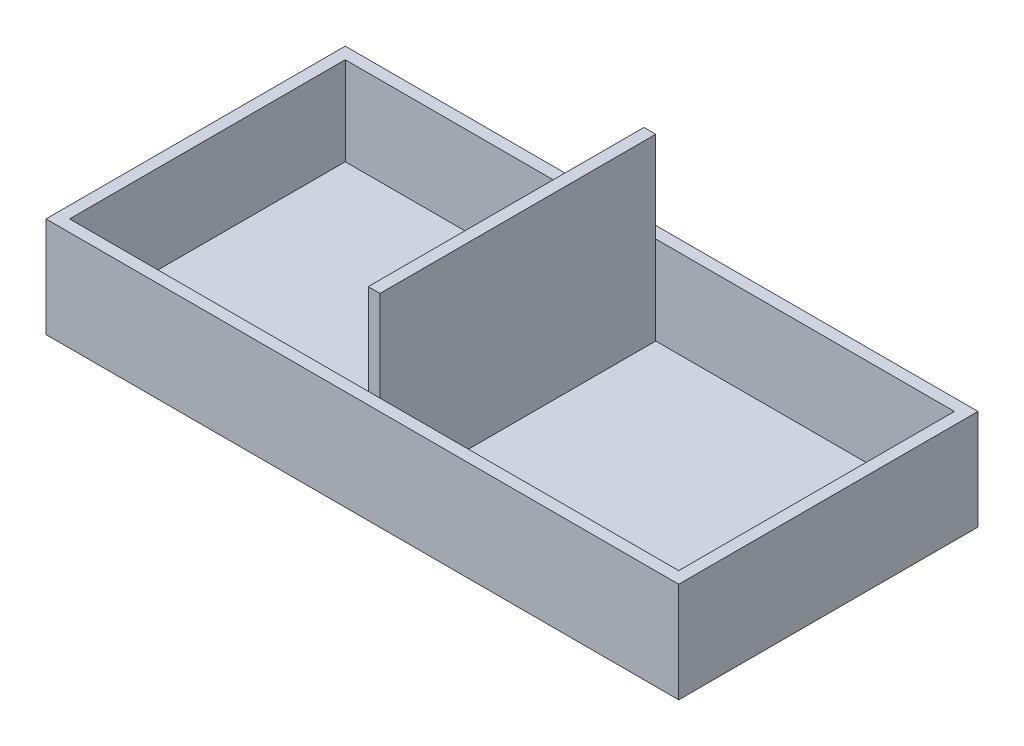
ISO-10303-21;
HEADER;
FILE_DESCRIPTION(('STEP AP214'),'2;1');
FILE_NAME('part.step','',(''),(''),'','','');
FILE_SCHEMA(('AUTOMOTIVE_DESIGN { 1 0 10303 214 1 1 1 1 }'));
ENDSEC;
DATA;
#1=APPLICATION_CONTEXT('core data for automotive mechanical design processes');
#2=APPLICATION_PROTOCOL_DEFINITION('international standard','automotive_design',2000,#1);
#3=PRODUCT_CONTEXT('',#1,'mechanical');
#4=PRODUCT('Part','Part','',(#3));
#5=PRODUCT_RELATED_PRODUCT_CATEGORY('part','',(#4));
#6=PRODUCT_DEFINITION_FORMATION('','',#4);
#7=PRODUCT_DEFINITION_CONTEXT('part definition',#1,'design');
#8=PRODUCT_DEFINITION('design','',#6,#7);
#9=PRODUCT_DEFINITION_SHAPE('','',#8);
#10=(LENGTH_UNIT() NAMED_UNIT(*) SI_UNIT(.MILLI.,.METRE.));
#11=(NAMED_UNIT(*) PLANE_ANGLE_UNIT() SI_UNIT($,.RADIAN.));
#12=(NAMED_UNIT(*) SI_UNIT($,.STERADIAN.) SOLID_ANGLE_UNIT());
#13=UNCERTAINTY_MEASURE_WITH_UNIT(LENGTH_MEASURE(1.E-05),#10,'distance_accuracy_value','');
#14=(GEOMETRIC_REPRESENTATION_CONTEXT(3) GLOBAL_UNCERTAINTY_ASSIGNED_CONTEXT((#13)) GLOBAL_UNIT_ASSIGNED_CONTEXT((#10,
#11,#12)) REPRESENTATION_CONTEXT('',''));
#15=CARTESIAN_POINT('',(0.,0.,0.));
#16=DIRECTION('',(0.,0.,1.));
#17=DIRECTION('',(1.,0.,0.));
#18=AXIS2_PLACEMENT_3D('',#15,#16,#17);
#19=CARTESIAN_POINT('',(10.,10.,-244.));
#20=DIRECTION('',(0.,0.,-1.));
#21=DIRECTION('',(-1.,0.,0.));
#22=AXIS2_PLACEMENT_3D('',#19,#20,#21);
#23=PLANE('',#22);
#24=DIRECTION('',(0.,-1.,0.));
#25=VECTOR('',#24,1.);
#26=CARTESIAN_POINT('',(263.5,162.,-244.));
#27=LINE('',#26,#25);
#28=CARTESIAN_POINT('',(263.5,85.,-244.));
#29=VERTEX_POINT('',#28);
#30=CARTESIAN_POINT('',(263.5,10.,-244.));
#31=VERTEX_POINT('',#30);
#32=EDGE_CURVE('E466',#29,#31,#27,.T.);
#33=ORIENTED_EDGE('',*,*,#32,.F.);
#34=DIRECTION('',(-1.,0.,0.));
#35=VECTOR('',#34,1.);
#36=CARTESIAN_POINT('',(10.,85.,-244.));
#37=LINE('',#36,#35);
#38=CARTESIAN_POINT('',(10.,85.,-244.));
#39=VERTEX_POINT('',#38);
#40=EDGE_CURVE('E196',#29,#39,#37,.T.);
#41=ORIENTED_EDGE('',*,*,#40,.T.);
#42=DIRECTION('',(0.,1.,0.));
#43=VECTOR('',#42,1.);
#44=CARTESIAN_POINT('',(10.,10.,-244.));
#45=LINE('',#44,#43);
#46=CARTESIAN_POINT('',(10.,10.,-244.));
#47=VERTEX_POINT('',#46);
#48=EDGE_CURVE('E199',#47,#39,#45,.T.);
#49=ORIENTED_EDGE('',*,*,#48,.F.);
#50=DIRECTION('',(-1.,0.,0.));
#51=VECTOR('',#50,1.);
#52=CARTESIAN_POINT('',(10.,10.,-244.));
#53=LINE('',#52,#51);
#54=EDGE_CURVE('E183',#31,#47,#53,.T.);
#55=ORIENTED_EDGE('',*,*,#54,.F.);
#56=EDGE_LOOP('',(#33,#41,#49,#55));
#57=FACE_BOUND('',#56,.T.);
#58=ADVANCED_FACE('F37',(#57),#23,.F.);
#59=DIRECTION('',(0.,-1.,0.));
#60=VECTOR('',#59,1.);
#61=CARTESIAN_POINT('',(273.5,162.,-244.));
#62=LINE('',#61,#60);
#63=CARTESIAN_POINT('',(273.5,85.,-244.));
#64=VERTEX_POINT('',#63);
#65=CARTESIAN_POINT('',(273.5,10.,-244.));
#66=VERTEX_POINT('',#65);
#67=EDGE_CURVE('E460',#64,#66,#62,.T.);
#68=ORIENTED_EDGE('',*,*,#67,.T.);
#69=CARTESIAN_POINT('',(527.,10.,-244.));
#70=VERTEX_POINT('',#69);
#71=EDGE_CURVE('E184',#70,#66,#53,.T.);
#72=ORIENTED_EDGE('',*,*,#71,.F.);
#73=DIRECTION('',(0.,1.,0.));
#74=VECTOR('',#73,1.);
#75=CARTESIAN_POINT('',(527.,10.,-244.));
#76=LINE('',#75,#74);
#77=CARTESIAN_POINT('',(527.,85.,-244.));
#78=VERTEX_POINT('',#77);
#79=EDGE_CURVE('E202',#70,#78,#76,.T.);
#80=ORIENTED_EDGE('',*,*,#79,.T.);
#81=EDGE_CURVE('E176',#78,#64,#37,.T.);
#82=ORIENTED_EDGE('',*,*,#81,.T.);
#83=EDGE_LOOP('',(#68,#72,#80,#82));
#84=FACE_BOUND('',#83,.T.);
#85=ADVANCED_FACE('F260',(#84),#23,.F.);
#86=CARTESIAN_POINT('',(10.,10.,-10.));
#87=DIRECTION('',(0.,0.,1.));
#88=DIRECTION('',(1.,0.,0.));
#89=AXIS2_PLACEMENT_3D('',#86,#87,#88);
#90=PLANE('',#89);
#91=DIRECTION('',(0.,-1.,0.));
#92=VECTOR('',#91,1.);
#93=CARTESIAN_POINT('',(263.5,162.,-10.));
#94=LINE('',#93,#92);
#95=CARTESIAN_POINT('',(263.5,85.,-10.));
#96=VERTEX_POINT('',#95);
#97=CARTESIAN_POINT('',(263.5,10.,-10.));
#98=VERTEX_POINT('',#97);
#99=EDGE_CURVE('E163',#96,#98,#94,.T.);
#100=ORIENTED_EDGE('',*,*,#99,.T.);
#101=DIRECTION('',(1.,0.,0.));
#102=VECTOR('',#101,1.);
#103=CARTESIAN_POINT('',(10.,10.,-10.));
#104=LINE('',#103,#102);
#105=CARTESIAN_POINT('',(10.,10.,-10.));
#106=VERTEX_POINT('',#105);
#107=EDGE_CURVE('E177',#106,#98,#104,.T.);
#108=ORIENTED_EDGE('',*,*,#107,.F.);
#109=DIRECTION('',(0.,1.,0.));
#110=VECTOR('',#109,1.);
#111=CARTESIAN_POINT('',(10.,10.,-10.));
#112=LINE('',#111,#110);
#113=CARTESIAN_POINT('',(10.,85.,-10.));
#114=VERTEX_POINT('',#113);
#115=EDGE_CURVE('E187',#106,#114,#112,.T.);
#116=ORIENTED_EDGE('',*,*,#115,.T.);
#117=DIRECTION('',(1.,0.,0.));
#118=VECTOR('',#117,1.);
#119=CARTESIAN_POINT('',(10.,85.,-10.));
#120=LINE('',#119,#118);
#121=EDGE_CURVE('E190',#114,#96,#120,.T.);
#122=ORIENTED_EDGE('',*,*,#121,.T.);
#123=EDGE_LOOP('',(#100,#108,#116,#122));
#124=FACE_BOUND('',#123,.T.);
#125=ADVANCED_FACE('F266',(#124),#90,.F.);
#126=DIRECTION('',(0.,-1.,0.));
#127=VECTOR('',#126,1.);
#128=CARTESIAN_POINT('',(273.5,162.,-10.));
#129=LINE('',#128,#127);
#130=CARTESIAN_POINT('',(273.5,85.,-10.));
#131=VERTEX_POINT('',#130);
#132=CARTESIAN_POINT('',(273.5,10.,-10.));
#133=VERTEX_POINT('',#132);
#134=EDGE_CURVE('E52',#131,#133,#129,.T.);
#135=ORIENTED_EDGE('',*,*,#134,.F.);
#136=CARTESIAN_POINT('',(527.,85.,-10.));
#137=VERTEX_POINT('',#136);
#138=EDGE_CURVE('E189',#131,#137,#120,.T.);
#139=ORIENTED_EDGE('',*,*,#138,.T.);
#140=DIRECTION('',(0.,1.,0.));
#141=VECTOR('',#140,1.);
#142=CARTESIAN_POINT('',(527.,10.,-10.));
#143=LINE('',#142,#141);
#144=CARTESIAN_POINT('',(527.,10.,-10.));
#145=VERTEX_POINT('',#144);
#146=EDGE_CURVE('E204',#145,#137,#143,.T.);
#147=ORIENTED_EDGE('',*,*,#146,.F.);
#148=EDGE_CURVE('E175',#133,#145,#104,.T.);
#149=ORIENTED_EDGE('',*,*,#148,.F.);
#150=EDGE_LOOP('',(#135,#139,#147,#149));
#151=FACE_BOUND('',#150,.T.);
#152=ADVANCED_FACE('F280',(#151),#90,.F.);
#153=CARTESIAN_POINT('',(0.,10.,0.));
#154=DIRECTION('',(0.,1.,0.));
#155=DIRECTION('',(0.,0.,1.));
#156=AXIS2_PLACEMENT_3D('',#153,#154,#155);
#157=PLANE('',#156);
#158=ORIENTED_EDGE('',*,*,#107,.T.);
#159=DIRECTION('',(0.,0.,1.));
#160=VECTOR('',#159,1.);
#161=CARTESIAN_POINT('',(263.5,10.,-244.));
#162=LINE('',#161,#160);
#163=EDGE_CURVE('E470',#31,#98,#162,.T.);
#164=ORIENTED_EDGE('',*,*,#163,.F.);
#165=ORIENTED_EDGE('',*,*,#54,.T.);
#166=DIRECTION('',(0.,0.,1.));
#167=VECTOR('',#166,1.);
#168=CARTESIAN_POINT('',(10.,10.,-244.));
#169=LINE('',#168,#167);
#170=EDGE_CURVE('E172',#47,#106,#169,.T.);
#171=ORIENTED_EDGE('',*,*,#170,.T.);
#172=EDGE_LOOP('',(#158,#164,#165,#171));
#173=FACE_BOUND('',#172,.T.);
#174=ADVANCED_FACE('F271',(#173),#157,.T.);
#175=ORIENTED_EDGE('',*,*,#71,.T.);
#176=DIRECTION('',(0.,0.,-1.));
#177=VECTOR('',#176,1.);
#178=CARTESIAN_POINT('',(273.5,10.,-244.));
#179=LINE('',#178,#177);
#180=EDGE_CURVE('E159',#133,#66,#179,.T.);
#181=ORIENTED_EDGE('',*,*,#180,.F.);
#182=ORIENTED_EDGE('',*,*,#148,.T.);
#183=DIRECTION('',(0.,0.,-1.));
#184=VECTOR('',#183,1.);
#185=CARTESIAN_POINT('',(527.,10.,-244.));
#186=LINE('',#185,#184);
#187=EDGE_CURVE('E180',#145,#70,#186,.T.);
#188=ORIENTED_EDGE('',*,*,#187,.T.);
#189=EDGE_LOOP('',(#175,#181,#182,#188));
#190=FACE_BOUND('',#189,.T.);
#191=ADVANCED_FACE('F258',(#190),#157,.T.);
#192=CARTESIAN_POINT('',(0.,85.,0.));
#193=DIRECTION('',(1.,0.,0.));
#194=DIRECTION('',(0.,0.,-1.));
#195=AXIS2_PLACEMENT_3D('',#192,#193,#194);
#196=PLANE('',#195);
#197=DIRECTION('',(0.,0.,1.));
#198=VECTOR('',#197,1.);
#199=CARTESIAN_POINT('',(0.,0.,0.));
#200=LINE('',#199,#198);
#201=CARTESIAN_POINT('',(0.,0.,-254.));
#202=VERTEX_POINT('',#201);
#203=CARTESIAN_POINT('',(0.,0.,0.));
#204=VERTEX_POINT('',#203);
#205=EDGE_CURVE('E201',#202,#204,#200,.T.);
#206=ORIENTED_EDGE('',*,*,#205,.T.);
#207=DIRECTION('',(0.,-1.,0.));
#208=VECTOR('',#207,1.);
#209=CARTESIAN_POINT('',(0.,85.,0.));
#210=LINE('',#209,#208);
#211=CARTESIAN_POINT('',(0.,85.,0.));
#212=VERTEX_POINT('',#211);
#213=EDGE_CURVE('E11',#212,#204,#210,.T.);
#214=ORIENTED_EDGE('',*,*,#213,.F.);
#215=DIRECTION('',(0.,0.,1.));
#216=VECTOR('',#215,1.);
#217=CARTESIAN_POINT('',(0.,85.,0.));
#218=LINE('',#217,#216);
#219=CARTESIAN_POINT('',(0.,85.,-254.));
#220=VERTEX_POINT('',#219);
#221=EDGE_CURVE('E208',#220,#212,#218,.T.);
#222=ORIENTED_EDGE('',*,*,#221,.F.);
#223=DIRECTION('',(0.,-1.,0.));
#224=VECTOR('',#223,1.);
#225=CARTESIAN_POINT('',(0.,85.,-254.));
#226=LINE('',#225,#224);
#227=EDGE_CURVE('E218',#220,#202,#226,.T.);
#228=ORIENTED_EDGE('',*,*,#227,.T.);
#229=EDGE_LOOP('',(#206,#214,#222,#228));
#230=FACE_BOUND('',#229,.T.);
#231=ADVANCED_FACE('F39',(#230),#196,.F.);
#232=CARTESIAN_POINT('',(0.,85.,0.));
#233=DIRECTION('',(0.,0.,-1.));
#234=DIRECTION('',(-1.,0.,0.));
#235=AXIS2_PLACEMENT_3D('',#232,#233,#234);
#236=PLANE('',#235);
#237=DIRECTION('',(1.,0.,0.));
#238=VECTOR('',#237,1.);
#239=CARTESIAN_POINT('',(0.,0.,0.));
#240=LINE('',#239,#238);
#241=CARTESIAN_POINT('',(537.,0.,0.));
#242=VERTEX_POINT('',#241);
#243=EDGE_CURVE('E221',#204,#242,#240,.T.);
#244=ORIENTED_EDGE('',*,*,#243,.T.);
#245=DIRECTION('',(0.,-1.,0.));
#246=VECTOR('',#245,1.);
#247=CARTESIAN_POINT('',(537.,85.,0.));
#248=LINE('',#247,#246);
#249=CARTESIAN_POINT('',(537.,85.,0.));
#250=VERTEX_POINT('',#249);
#251=EDGE_CURVE('E45',#250,#242,#248,.T.);
#252=ORIENTED_EDGE('',*,*,#251,.F.);
#253=DIRECTION('',(1.,0.,0.));
#254=VECTOR('',#253,1.);
#255=CARTESIAN_POINT('',(0.,85.,0.));
#256=LINE('',#255,#254);
#257=EDGE_CURVE('E211',#212,#250,#256,.T.);
#258=ORIENTED_EDGE('',*,*,#257,.F.);
#259=ORIENTED_EDGE('',*,*,#213,.T.);
#260=EDGE_LOOP('',(#244,#252,#258,#259));
#261=FACE_BOUND('',#260,.T.);
#262=ADVANCED_FACE('F251',(#261),#236,.F.);
#263=CARTESIAN_POINT('',(537.,85.,0.));
#264=DIRECTION('',(-1.,0.,0.));
#265=DIRECTION('',(0.,0.,1.));
#266=AXIS2_PLACEMENT_3D('',#263,#264,#265);
#267=PLANE('',#266);
#268=DIRECTION('',(0.,0.,-1.));
#269=VECTOR('',#268,1.);
#270=CARTESIAN_POINT('',(537.,0.,0.));
#271=LINE('',#270,#269);
#272=CARTESIAN_POINT('',(537.,0.,-254.));
#273=VERTEX_POINT('',#272);
#274=EDGE_CURVE('E223',#242,#273,#271,.T.);
#275=ORIENTED_EDGE('',*,*,#274,.T.);
#276=DIRECTION('',(0.,-1.,0.));
#277=VECTOR('',#276,1.);
#278=CARTESIAN_POINT('',(537.,85.,-254.));
#279=LINE('',#278,#277);
#280=CARTESIAN_POINT('',(537.,85.,-254.));
#281=VERTEX_POINT('',#280);
#282=EDGE_CURVE('E228',#281,#273,#279,.T.);
#283=ORIENTED_EDGE('',*,*,#282,.F.);
#284=DIRECTION('',(0.,0.,-1.));
#285=VECTOR('',#284,1.);
#286=CARTESIAN_POINT('',(537.,85.,0.));
#287=LINE('',#286,#285);
#288=EDGE_CURVE('E214',#250,#281,#287,.T.);
#289=ORIENTED_EDGE('',*,*,#288,.F.);
#290=ORIENTED_EDGE('',*,*,#251,.T.);
#291=EDGE_LOOP('',(#275,#283,#289,#290));
#292=FACE_BOUND('',#291,.T.);
#293=ADVANCED_FACE('F235',(#292),#267,.F.);
#294=CARTESIAN_POINT('',(0.,85.,-254.));
#295=DIRECTION('',(0.,0.,1.));
#296=DIRECTION('',(1.,0.,0.));
#297=AXIS2_PLACEMENT_3D('',#294,#295,#296);
#298=PLANE('',#297);
#299=DIRECTION('',(-1.,0.,0.));
#300=VECTOR('',#299,1.);
#301=CARTESIAN_POINT('',(0.,0.,-254.));
#302=LINE('',#301,#300);
#303=EDGE_CURVE('E212',#273,#202,#302,.T.);
#304=ORIENTED_EDGE('',*,*,#303,.T.);
#305=ORIENTED_EDGE('',*,*,#227,.F.);
#306=DIRECTION('',(-1.,0.,0.));
#307=VECTOR('',#306,1.);
#308=CARTESIAN_POINT('',(0.,85.,-254.));
#309=LINE('',#308,#307);
#310=EDGE_CURVE('E216',#281,#220,#309,.T.);
#311=ORIENTED_EDGE('',*,*,#310,.F.);
#312=ORIENTED_EDGE('',*,*,#282,.T.);
#313=EDGE_LOOP('',(#304,#305,#311,#312));
#314=FACE_BOUND('',#313,.T.);
#315=ADVANCED_FACE('F244',(#314),#298,.F.);
#316=CARTESIAN_POINT('',(0.,85.,0.));
#317=DIRECTION('',(0.,-1.,0.));
#318=DIRECTION('',(0.,0.,-1.));
#319=AXIS2_PLACEMENT_3D('',#316,#317,#318);
#320=PLANE('',#319);
#321=ORIENTED_EDGE('',*,*,#121,.F.);
#322=DIRECTION('',(0.,0.,1.));
#323=VECTOR('',#322,1.);
#324=CARTESIAN_POINT('',(10.,85.,-244.));
#325=LINE('',#324,#323);
#326=EDGE_CURVE('E60',#39,#114,#325,.T.);
#327=ORIENTED_EDGE('',*,*,#326,.F.);
#328=ORIENTED_EDGE('',*,*,#40,.F.);
#329=DIRECTION('',(-1.,0.,0.));
#330=VECTOR('',#329,1.);
#331=CARTESIAN_POINT('',(0.,85.,-244.));
#332=LINE('',#331,#330);
#333=EDGE_CURVE('E164',#64,#29,#332,.T.);
#334=ORIENTED_EDGE('',*,*,#333,.F.);
#335=ORIENTED_EDGE('',*,*,#81,.F.);
#336=DIRECTION('',(0.,0.,-1.));
#337=VECTOR('',#336,1.);
#338=CARTESIAN_POINT('',(527.,85.,-244.));
#339=LINE('',#338,#337);
#340=EDGE_CURVE('E193',#137,#78,#339,.T.);
#341=ORIENTED_EDGE('',*,*,#340,.F.);
#342=ORIENTED_EDGE('',*,*,#138,.F.);
#343=DIRECTION('',(1.,0.,0.));
#344=VECTOR('',#343,1.);
#345=CARTESIAN_POINT('',(0.,85.,-10.));
#346=LINE('',#345,#344);
#347=EDGE_CURVE('E166',#96,#131,#346,.T.);
#348=ORIENTED_EDGE('',*,*,#347,.F.);
#349=EDGE_LOOP('',(#321,#327,#328,#334,#335,#341,#342,#348));
#350=FACE_BOUND('',#349,.T.);
#351=ORIENTED_EDGE('',*,*,#221,.T.);
#352=ORIENTED_EDGE('',*,*,#257,.T.);
#353=ORIENTED_EDGE('',*,*,#288,.T.);
#354=ORIENTED_EDGE('',*,*,#310,.T.);
#355=EDGE_LOOP('',(#351,#352,#353,#354));
#356=FACE_BOUND('',#355,.T.);
#357=ADVANCED_FACE('F250',(#350,#356),#320,.F.);
#358=CARTESIAN_POINT('',(0.,0.,0.));
#359=DIRECTION('',(0.,-1.,0.));
#360=DIRECTION('',(0.,0.,-1.));
#361=AXIS2_PLACEMENT_3D('',#358,#359,#360);
#362=PLANE('',#361);
#363=ORIENTED_EDGE('',*,*,#205,.F.);
#364=ORIENTED_EDGE('',*,*,#303,.F.);
#365=ORIENTED_EDGE('',*,*,#274,.F.);
#366=ORIENTED_EDGE('',*,*,#243,.F.);
#367=EDGE_LOOP('',(#363,#364,#365,#366));
#368=FACE_BOUND('',#367,.T.);
#369=ADVANCED_FACE('F241',(#368),#362,.T.);
#370=CARTESIAN_POINT('',(10.,10.,-244.));
#371=DIRECTION('',(-1.,0.,0.));
#372=DIRECTION('',(0.,0.,1.));
#373=AXIS2_PLACEMENT_3D('',#370,#371,#372);
#374=PLANE('',#373);
#375=ORIENTED_EDGE('',*,*,#326,.T.);
#376=ORIENTED_EDGE('',*,*,#115,.F.);
#377=ORIENTED_EDGE('',*,*,#170,.F.);
#378=ORIENTED_EDGE('',*,*,#48,.T.);
#379=EDGE_LOOP('',(#375,#376,#377,#378));
#380=FACE_BOUND('',#379,.T.);
#381=ADVANCED_FACE('F276',(#380),#374,.F.);
#382=CARTESIAN_POINT('',(527.,10.,-244.));
#383=DIRECTION('',(1.,0.,0.));
#384=DIRECTION('',(0.,0.,-1.));
#385=AXIS2_PLACEMENT_3D('',#382,#383,#384);
#386=PLANE('',#385);
#387=ORIENTED_EDGE('',*,*,#340,.T.);
#388=ORIENTED_EDGE('',*,*,#79,.F.);
#389=ORIENTED_EDGE('',*,*,#187,.F.);
#390=ORIENTED_EDGE('',*,*,#146,.T.);
#391=EDGE_LOOP('',(#387,#388,#389,#390));
#392=FACE_BOUND('',#391,.T.);
#393=ADVANCED_FACE('F273',(#392),#386,.F.);
#394=CARTESIAN_POINT('',(263.5,162.,-10.));
#395=DIRECTION('',(0.,0.,-1.));
#396=DIRECTION('',(-1.,0.,0.));
#397=AXIS2_PLACEMENT_3D('',#394,#395,#396);
#398=PLANE('',#397);
#399=CARTESIAN_POINT('',(263.5,162.,-10.));
#400=VERTEX_POINT('',#399);
#401=EDGE_CURVE('E144',#400,#96,#94,.T.);
#402=ORIENTED_EDGE('',*,*,#401,.T.);
#403=ORIENTED_EDGE('',*,*,#347,.T.);
#404=CARTESIAN_POINT('',(273.5,162.,-10.));
#405=VERTEX_POINT('',#404);
#406=EDGE_CURVE('E146',#405,#131,#129,.T.);
#407=ORIENTED_EDGE('',*,*,#406,.F.);
#408=DIRECTION('',(1.,0.,0.));
#409=VECTOR('',#408,1.);
#410=CARTESIAN_POINT('',(263.5,162.,-10.));
#411=LINE('',#410,#409);
#412=EDGE_CURVE('E140',#400,#405,#411,.T.);
#413=ORIENTED_EDGE('',*,*,#412,.F.);
#414=EDGE_LOOP('',(#402,#403,#407,#413));
#415=FACE_BOUND('',#414,.T.);
#416=ADVANCED_FACE('F142',(#415),#398,.F.);
#417=CARTESIAN_POINT('',(263.5,162.,-244.));
#418=DIRECTION('',(0.,0.,1.));
#419=DIRECTION('',(1.,0.,0.));
#420=AXIS2_PLACEMENT_3D('',#417,#418,#419);
#421=PLANE('',#420);
#422=CARTESIAN_POINT('',(273.5,162.,-244.));
#423=VERTEX_POINT('',#422);
#424=EDGE_CURVE('E464',#423,#64,#62,.T.);
#425=ORIENTED_EDGE('',*,*,#424,.T.);
#426=ORIENTED_EDGE('',*,*,#333,.T.);
#427=CARTESIAN_POINT('',(263.5,162.,-244.));
#428=VERTEX_POINT('',#427);
#429=EDGE_CURVE('E465',#428,#29,#27,.T.);
#430=ORIENTED_EDGE('',*,*,#429,.F.);
#431=DIRECTION('',(-1.,0.,0.));
#432=VECTOR('',#431,1.);
#433=CARTESIAN_POINT('',(263.5,162.,-244.));
#434=LINE('',#433,#432);
#435=EDGE_CURVE('E155',#423,#428,#434,.T.);
#436=ORIENTED_EDGE('',*,*,#435,.F.);
#437=EDGE_LOOP('',(#425,#426,#430,#436));
#438=FACE_BOUND('',#437,.T.);
#439=ADVANCED_FACE('F317',(#438),#421,.F.);
#440=CARTESIAN_POINT('',(263.5,162.,-244.));
#441=DIRECTION('',(1.,0.,0.));
#442=DIRECTION('',(0.,0.,-1.));
#443=AXIS2_PLACEMENT_3D('',#440,#441,#442);
#444=PLANE('',#443);
#445=ORIENTED_EDGE('',*,*,#163,.T.);
#446=ORIENTED_EDGE('',*,*,#99,.F.);
#447=ORIENTED_EDGE('',*,*,#401,.F.);
#448=DIRECTION('',(0.,0.,1.));
#449=VECTOR('',#448,1.);
#450=CARTESIAN_POINT('',(263.5,162.,-244.));
#451=LINE('',#450,#449);
#452=EDGE_CURVE('E150',#428,#400,#451,.T.);
#453=ORIENTED_EDGE('',*,*,#452,.F.);
#454=ORIENTED_EDGE('',*,*,#429,.T.);
#455=ORIENTED_EDGE('',*,*,#32,.T.);
#456=EDGE_LOOP('',(#445,#446,#447,#453,#454,#455));
#457=FACE_BOUND('',#456,.T.);
#458=ADVANCED_FACE('F161',(#457),#444,.F.);
#459=CARTESIAN_POINT('',(273.5,162.,-244.));
#460=DIRECTION('',(-1.,0.,0.));
#461=DIRECTION('',(0.,0.,1.));
#462=AXIS2_PLACEMENT_3D('',#459,#460,#461);
#463=PLANE('',#462);
#464=ORIENTED_EDGE('',*,*,#180,.T.);
#465=ORIENTED_EDGE('',*,*,#67,.F.);
#466=ORIENTED_EDGE('',*,*,#424,.F.);
#467=DIRECTION('',(0.,0.,-1.));
#468=VECTOR('',#467,1.);
#469=CARTESIAN_POINT('',(273.5,162.,-244.));
#470=LINE('',#469,#468);
#471=EDGE_CURVE('E149',#405,#423,#470,.T.);
#472=ORIENTED_EDGE('',*,*,#471,.F.);
#473=ORIENTED_EDGE('',*,*,#406,.T.);
#474=ORIENTED_EDGE('',*,*,#134,.T.);
#475=EDGE_LOOP('',(#464,#465,#466,#472,#473,#474));
#476=FACE_BOUND('',#475,.T.);
#477=ADVANCED_FACE('F331',(#476),#463,.F.);
#478=CARTESIAN_POINT('',(0.,162.,0.));
#479=DIRECTION('',(0.,1.,0.));
#480=DIRECTION('',(0.,0.,1.));
#481=AXIS2_PLACEMENT_3D('',#478,#479,#480);
#482=PLANE('',#481);
#483=ORIENTED_EDGE('',*,*,#452,.T.);
#484=ORIENTED_EDGE('',*,*,#412,.T.);
#485=ORIENTED_EDGE('',*,*,#471,.T.);
#486=ORIENTED_EDGE('',*,*,#435,.T.);
#487=EDGE_LOOP('',(#483,#484,#485,#486));
#488=FACE_BOUND('',#487,.T.);
#489=ADVANCED_FACE('F153',(#488),#482,.T.);
#490=CLOSED_SHELL('',(#58,#85,#125,#152,#174,#191,#231,#262,#293,#315,#357,#369,#381,#393,#416,
#439,#458,#477,#489));
#491=MANIFOLD_SOLID_BREP('B2',#490);
#492=ADVANCED_BREP_SHAPE_REPRESENTATION('',(#18,#491),#14);
#493=SHAPE_DEFINITION_REPRESENTATION(#9,#492);
ENDSEC;
END-ISO-10303-21;
